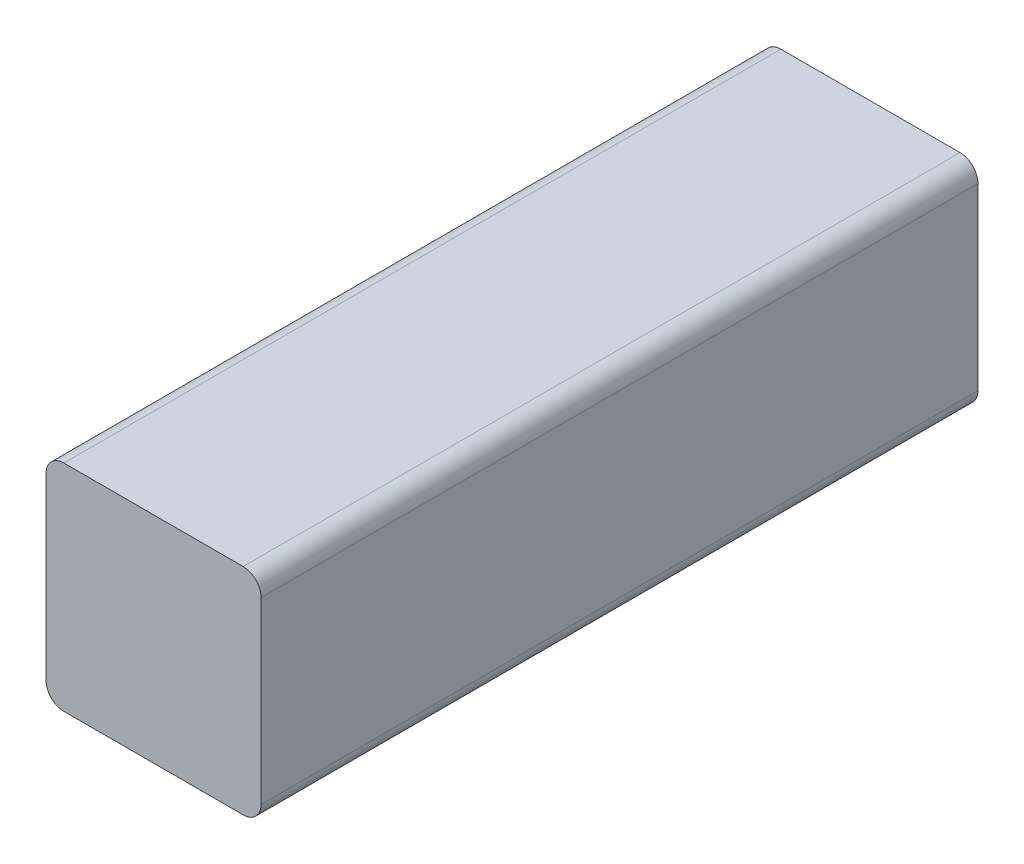
ISO-10303-21;
HEADER;
FILE_DESCRIPTION(('STEP AP214'),'2;1');
FILE_NAME('part.step','',(''),(''),'','','');
FILE_SCHEMA(('AUTOMOTIVE_DESIGN { 1 0 10303 214 1 1 1 1 }'));
ENDSEC;
DATA;
#1=APPLICATION_CONTEXT('core data for automotive mechanical design processes');
#2=APPLICATION_PROTOCOL_DEFINITION('international standard','automotive_design',2000,#1);
#3=PRODUCT_CONTEXT('',#1,'mechanical');
#4=PRODUCT('Part','Part','',(#3));
#5=PRODUCT_RELATED_PRODUCT_CATEGORY('part','',(#4));
#6=PRODUCT_DEFINITION_FORMATION('','',#4);
#7=PRODUCT_DEFINITION_CONTEXT('part definition',#1,'design');
#8=PRODUCT_DEFINITION('design','',#6,#7);
#9=PRODUCT_DEFINITION_SHAPE('','',#8);
#10=(LENGTH_UNIT() NAMED_UNIT(*) SI_UNIT(.MILLI.,.METRE.));
#11=(NAMED_UNIT(*) PLANE_ANGLE_UNIT() SI_UNIT($,.RADIAN.));
#12=(NAMED_UNIT(*) SI_UNIT($,.STERADIAN.) SOLID_ANGLE_UNIT());
#13=UNCERTAINTY_MEASURE_WITH_UNIT(LENGTH_MEASURE(1.E-05),#10,'distance_accuracy_value','');
#14=(GEOMETRIC_REPRESENTATION_CONTEXT(3) GLOBAL_UNCERTAINTY_ASSIGNED_CONTEXT((#13)) GLOBAL_UNIT_ASSIGNED_CONTEXT((#10,
#11,#12)) REPRESENTATION_CONTEXT('',''));
#15=CARTESIAN_POINT('',(0.,0.,0.));
#16=DIRECTION('',(0.,0.,1.));
#17=DIRECTION('',(1.,0.,0.));
#18=AXIS2_PLACEMENT_3D('',#15,#16,#17);
#19=CARTESIAN_POINT('',(-2.5,10.8,-20.));
#20=DIRECTION('',(0.,0.,1.));
#21=DIRECTION('',(1.,0.,0.));
#22=AXIS2_PLACEMENT_3D('',#19,#20,#21);
#23=CYLINDRICAL_SURFACE('',#22,0.5);
#24=CARTESIAN_POINT('',(-2.5,10.8,0.));
#25=DIRECTION('',(0.,0.,1.));
#26=DIRECTION('',(1.,0.,0.));
#27=AXIS2_PLACEMENT_3D('',#24,#25,#26);
#28=CIRCLE('',#27,0.5);
#29=CARTESIAN_POINT('',(-2.5,11.3,0.));
#30=VERTEX_POINT('',#29);
#31=CARTESIAN_POINT('',(-3.,10.8,0.));
#32=VERTEX_POINT('',#31);
#33=EDGE_CURVE('E129',#30,#32,#28,.T.);
#34=ORIENTED_EDGE('',*,*,#33,.F.);
#35=DIRECTION('',(0.,0.,1.));
#36=VECTOR('',#35,1.);
#37=CARTESIAN_POINT('',(-2.5,11.3,-20.));
#38=LINE('',#37,#36);
#39=CARTESIAN_POINT('',(-2.5,11.3,-20.));
#40=VERTEX_POINT('',#39);
#41=EDGE_CURVE('E11',#40,#30,#38,.T.);
#42=ORIENTED_EDGE('',*,*,#41,.F.);
#43=CARTESIAN_POINT('',(-2.5,10.8,-20.));
#44=DIRECTION('',(0.,0.,1.));
#45=DIRECTION('',(1.,0.,0.));
#46=AXIS2_PLACEMENT_3D('',#43,#44,#45);
#47=CIRCLE('',#46,0.5);
#48=CARTESIAN_POINT('',(-3.,10.8,-20.));
#49=VERTEX_POINT('',#48);
#50=EDGE_CURVE('E149',#40,#49,#47,.T.);
#51=ORIENTED_EDGE('',*,*,#50,.T.);
#52=DIRECTION('',(0.,0.,1.));
#53=VECTOR('',#52,1.);
#54=CARTESIAN_POINT('',(-3.,10.8,-20.));
#55=LINE('',#54,#53);
#56=EDGE_CURVE('E35',#49,#32,#55,.T.);
#57=ORIENTED_EDGE('',*,*,#56,.T.);
#58=EDGE_LOOP('',(#34,#42,#51,#57));
#59=FACE_BOUND('',#58,.T.);
#60=ADVANCED_FACE('F32',(#59),#23,.T.);
#61=CARTESIAN_POINT('',(2.5,11.3,-20.));
#62=DIRECTION('',(0.,1.,0.));
#63=DIRECTION('',(0.,0.,1.));
#64=AXIS2_PLACEMENT_3D('',#61,#62,#63);
#65=PLANE('',#64);
#66=DIRECTION('',(-1.,0.,0.));
#67=VECTOR('',#66,1.);
#68=CARTESIAN_POINT('',(2.5,11.3,0.));
#69=LINE('',#68,#67);
#70=CARTESIAN_POINT('',(2.5,11.3,0.));
#71=VERTEX_POINT('',#70);
#72=EDGE_CURVE('E147',#71,#30,#69,.T.);
#73=ORIENTED_EDGE('',*,*,#72,.F.);
#74=DIRECTION('',(0.,0.,1.));
#75=VECTOR('',#74,1.);
#76=CARTESIAN_POINT('',(2.5,11.3,-20.));
#77=LINE('',#76,#75);
#78=CARTESIAN_POINT('',(2.5,11.3,-20.));
#79=VERTEX_POINT('',#78);
#80=EDGE_CURVE('E41',#79,#71,#77,.T.);
#81=ORIENTED_EDGE('',*,*,#80,.F.);
#82=DIRECTION('',(-1.,0.,0.));
#83=VECTOR('',#82,1.);
#84=CARTESIAN_POINT('',(2.5,11.3,-20.));
#85=LINE('',#84,#83);
#86=EDGE_CURVE('E119',#79,#40,#85,.T.);
#87=ORIENTED_EDGE('',*,*,#86,.T.);
#88=ORIENTED_EDGE('',*,*,#41,.T.);
#89=EDGE_LOOP('',(#73,#81,#87,#88));
#90=FACE_BOUND('',#89,.T.);
#91=ADVANCED_FACE('F161',(#90),#65,.T.);
#92=CARTESIAN_POINT('',(2.5,10.8,-20.));
#93=DIRECTION('',(0.,0.,1.));
#94=DIRECTION('',(1.,0.,0.));
#95=AXIS2_PLACEMENT_3D('',#92,#93,#94);
#96=CYLINDRICAL_SURFACE('',#95,0.5);
#97=CARTESIAN_POINT('',(2.5,10.8,0.));
#98=DIRECTION('',(0.,0.,1.));
#99=DIRECTION('',(-1.,0.,0.));
#100=AXIS2_PLACEMENT_3D('',#97,#98,#99);
#101=CIRCLE('',#100,0.5);
#102=CARTESIAN_POINT('',(3.,10.8,0.));
#103=VERTEX_POINT('',#102);
#104=EDGE_CURVE('E106',#103,#71,#101,.T.);
#105=ORIENTED_EDGE('',*,*,#104,.F.);
#106=DIRECTION('',(0.,0.,1.));
#107=VECTOR('',#106,1.);
#108=CARTESIAN_POINT('',(3.,10.8,-20.));
#109=LINE('',#108,#107);
#110=CARTESIAN_POINT('',(3.,10.8,-20.));
#111=VERTEX_POINT('',#110);
#112=EDGE_CURVE('E101',#111,#103,#109,.T.);
#113=ORIENTED_EDGE('',*,*,#112,.F.);
#114=CARTESIAN_POINT('',(2.5,10.8,-20.));
#115=DIRECTION('',(0.,0.,1.));
#116=DIRECTION('',(-1.,0.,0.));
#117=AXIS2_PLACEMENT_3D('',#114,#115,#116);
#118=CIRCLE('',#117,0.5);
#119=EDGE_CURVE('E104',#111,#79,#118,.T.);
#120=ORIENTED_EDGE('',*,*,#119,.T.);
#121=ORIENTED_EDGE('',*,*,#80,.T.);
#122=EDGE_LOOP('',(#105,#113,#120,#121));
#123=FACE_BOUND('',#122,.T.);
#124=ADVANCED_FACE('F103',(#123),#96,.T.);
#125=CARTESIAN_POINT('',(3.,10.8,-20.));
#126=DIRECTION('',(1.,0.,0.));
#127=DIRECTION('',(0.,0.,-1.));
#128=AXIS2_PLACEMENT_3D('',#125,#126,#127);
#129=PLANE('',#128);
#130=DIRECTION('',(0.,1.,0.));
#131=VECTOR('',#130,1.);
#132=CARTESIAN_POINT('',(3.,10.8,0.));
#133=LINE('',#132,#131);
#134=CARTESIAN_POINT('',(3.,5.80000000000001,0.));
#135=VERTEX_POINT('',#134);
#136=EDGE_CURVE('E144',#135,#103,#133,.T.);
#137=ORIENTED_EDGE('',*,*,#136,.F.);
#138=DIRECTION('',(0.,0.,1.));
#139=VECTOR('',#138,1.);
#140=CARTESIAN_POINT('',(3.,5.80000000000001,-20.));
#141=LINE('',#140,#139);
#142=CARTESIAN_POINT('',(3.,5.80000000000001,-20.));
#143=VERTEX_POINT('',#142);
#144=EDGE_CURVE('E111',#143,#135,#141,.T.);
#145=ORIENTED_EDGE('',*,*,#144,.F.);
#146=DIRECTION('',(0.,1.,0.));
#147=VECTOR('',#146,1.);
#148=CARTESIAN_POINT('',(3.,10.8,-20.));
#149=LINE('',#148,#147);
#150=EDGE_CURVE('E117',#143,#111,#149,.T.);
#151=ORIENTED_EDGE('',*,*,#150,.T.);
#152=ORIENTED_EDGE('',*,*,#112,.T.);
#153=EDGE_LOOP('',(#137,#145,#151,#152));
#154=FACE_BOUND('',#153,.T.);
#155=ADVANCED_FACE('F121',(#154),#129,.T.);
#156=CARTESIAN_POINT('',(2.5,5.8,-20.));
#157=DIRECTION('',(0.,0.,1.));
#158=DIRECTION('',(1.,0.,0.));
#159=AXIS2_PLACEMENT_3D('',#156,#157,#158);
#160=CYLINDRICAL_SURFACE('',#159,0.5);
#161=CARTESIAN_POINT('',(2.5,5.8,0.));
#162=DIRECTION('',(0.,0.,1.));
#163=DIRECTION('',(-1.,0.,0.));
#164=AXIS2_PLACEMENT_3D('',#161,#162,#163);
#165=CIRCLE('',#164,0.5);
#166=CARTESIAN_POINT('',(2.5,5.3,0.));
#167=VERTEX_POINT('',#166);
#168=EDGE_CURVE('E141',#167,#135,#165,.T.);
#169=ORIENTED_EDGE('',*,*,#168,.F.);
#170=DIRECTION('',(0.,0.,1.));
#171=VECTOR('',#170,1.);
#172=CARTESIAN_POINT('',(2.5,5.3,-20.));
#173=LINE('',#172,#171);
#174=CARTESIAN_POINT('',(2.5,5.3,-20.));
#175=VERTEX_POINT('',#174);
#176=EDGE_CURVE('E153',#175,#167,#173,.T.);
#177=ORIENTED_EDGE('',*,*,#176,.F.);
#178=CARTESIAN_POINT('',(2.5,5.8,-20.));
#179=DIRECTION('',(0.,0.,1.));
#180=DIRECTION('',(-1.,0.,0.));
#181=AXIS2_PLACEMENT_3D('',#178,#179,#180);
#182=CIRCLE('',#181,0.5);
#183=EDGE_CURVE('E122',#175,#143,#182,.T.);
#184=ORIENTED_EDGE('',*,*,#183,.T.);
#185=ORIENTED_EDGE('',*,*,#144,.T.);
#186=EDGE_LOOP('',(#169,#177,#184,#185));
#187=FACE_BOUND('',#186,.T.);
#188=ADVANCED_FACE('F174',(#187),#160,.T.);
#189=CARTESIAN_POINT('',(2.5,5.3,-20.));
#190=DIRECTION('',(0.,-1.,0.));
#191=DIRECTION('',(0.,0.,-1.));
#192=AXIS2_PLACEMENT_3D('',#189,#190,#191);
#193=PLANE('',#192);
#194=DIRECTION('',(1.,0.,0.));
#195=VECTOR('',#194,1.);
#196=CARTESIAN_POINT('',(2.5,5.3,0.));
#197=LINE('',#196,#195);
#198=CARTESIAN_POINT('',(-2.5,5.3,0.));
#199=VERTEX_POINT('',#198);
#200=EDGE_CURVE('E138',#199,#167,#197,.T.);
#201=ORIENTED_EDGE('',*,*,#200,.F.);
#202=DIRECTION('',(0.,0.,1.));
#203=VECTOR('',#202,1.);
#204=CARTESIAN_POINT('',(-2.5,5.3,-20.));
#205=LINE('',#204,#203);
#206=CARTESIAN_POINT('',(-2.5,5.3,-20.));
#207=VERTEX_POINT('',#206);
#208=EDGE_CURVE('E155',#207,#199,#205,.T.);
#209=ORIENTED_EDGE('',*,*,#208,.F.);
#210=DIRECTION('',(1.,0.,0.));
#211=VECTOR('',#210,1.);
#212=CARTESIAN_POINT('',(2.5,5.3,-20.));
#213=LINE('',#212,#211);
#214=EDGE_CURVE('E124',#207,#175,#213,.T.);
#215=ORIENTED_EDGE('',*,*,#214,.T.);
#216=ORIENTED_EDGE('',*,*,#176,.T.);
#217=EDGE_LOOP('',(#201,#209,#215,#216));
#218=FACE_BOUND('',#217,.T.);
#219=ADVANCED_FACE('F177',(#218),#193,.T.);
#220=CARTESIAN_POINT('',(-2.5,5.8,-20.));
#221=DIRECTION('',(0.,0.,1.));
#222=DIRECTION('',(1.,0.,0.));
#223=AXIS2_PLACEMENT_3D('',#220,#221,#222);
#224=CYLINDRICAL_SURFACE('',#223,0.5);
#225=CARTESIAN_POINT('',(-2.5,5.8,0.));
#226=DIRECTION('',(0.,0.,1.));
#227=DIRECTION('',(-1.,0.,0.));
#228=AXIS2_PLACEMENT_3D('',#225,#226,#227);
#229=CIRCLE('',#228,0.5);
#230=CARTESIAN_POINT('',(-3.,5.8,0.));
#231=VERTEX_POINT('',#230);
#232=EDGE_CURVE('E135',#231,#199,#229,.T.);
#233=ORIENTED_EDGE('',*,*,#232,.F.);
#234=DIRECTION('',(0.,0.,1.));
#235=VECTOR('',#234,1.);
#236=CARTESIAN_POINT('',(-3.,5.8,-20.));
#237=LINE('',#236,#235);
#238=CARTESIAN_POINT('',(-3.,5.8,-20.));
#239=VERTEX_POINT('',#238);
#240=EDGE_CURVE('E156',#239,#231,#237,.T.);
#241=ORIENTED_EDGE('',*,*,#240,.F.);
#242=CARTESIAN_POINT('',(-2.5,5.8,-20.));
#243=DIRECTION('',(0.,0.,1.));
#244=DIRECTION('',(-1.,0.,0.));
#245=AXIS2_PLACEMENT_3D('',#242,#243,#244);
#246=CIRCLE('',#245,0.5);
#247=EDGE_CURVE('E252',#239,#207,#246,.T.);
#248=ORIENTED_EDGE('',*,*,#247,.T.);
#249=ORIENTED_EDGE('',*,*,#208,.T.);
#250=EDGE_LOOP('',(#233,#241,#248,#249));
#251=FACE_BOUND('',#250,.T.);
#252=ADVANCED_FACE('F181',(#251),#224,.T.);
#253=CARTESIAN_POINT('',(-3.,10.8,-20.));
#254=DIRECTION('',(-1.,0.,0.));
#255=DIRECTION('',(0.,0.,1.));
#256=AXIS2_PLACEMENT_3D('',#253,#254,#255);
#257=PLANE('',#256);
#258=DIRECTION('',(0.,-1.,0.));
#259=VECTOR('',#258,1.);
#260=CARTESIAN_POINT('',(-3.,10.8,0.));
#261=LINE('',#260,#259);
#262=EDGE_CURVE('E132',#32,#231,#261,.T.);
#263=ORIENTED_EDGE('',*,*,#262,.F.);
#264=ORIENTED_EDGE('',*,*,#56,.F.);
#265=DIRECTION('',(0.,-1.,0.));
#266=VECTOR('',#265,1.);
#267=CARTESIAN_POINT('',(-3.,10.8,-20.));
#268=LINE('',#267,#266);
#269=EDGE_CURVE('E253',#49,#239,#268,.T.);
#270=ORIENTED_EDGE('',*,*,#269,.T.);
#271=ORIENTED_EDGE('',*,*,#240,.T.);
#272=EDGE_LOOP('',(#263,#264,#270,#271));
#273=FACE_BOUND('',#272,.T.);
#274=ADVANCED_FACE('F158',(#273),#257,.T.);
#275=CARTESIAN_POINT('',(-2.5,10.8,-20.));
#276=DIRECTION('',(0.,0.,1.));
#277=DIRECTION('',(1.,0.,0.));
#278=AXIS2_PLACEMENT_3D('',#275,#276,#277);
#279=PLANE('',#278);
#280=ORIENTED_EDGE('',*,*,#50,.F.);
#281=ORIENTED_EDGE('',*,*,#86,.F.);
#282=ORIENTED_EDGE('',*,*,#119,.F.);
#283=ORIENTED_EDGE('',*,*,#150,.F.);
#284=ORIENTED_EDGE('',*,*,#183,.F.);
#285=ORIENTED_EDGE('',*,*,#214,.F.);
#286=ORIENTED_EDGE('',*,*,#247,.F.);
#287=ORIENTED_EDGE('',*,*,#269,.F.);
#288=EDGE_LOOP('',(#280,#281,#282,#283,#284,#285,#286,#287));
#289=FACE_BOUND('',#288,.T.);
#290=ADVANCED_FACE('F115',(#289),#279,.F.);
#291=CARTESIAN_POINT('',(-2.5,10.8,0.));
#292=DIRECTION('',(0.,0.,1.));
#293=DIRECTION('',(1.,0.,0.));
#294=AXIS2_PLACEMENT_3D('',#291,#292,#293);
#295=PLANE('',#294);
#296=ORIENTED_EDGE('',*,*,#33,.T.);
#297=ORIENTED_EDGE('',*,*,#262,.T.);
#298=ORIENTED_EDGE('',*,*,#232,.T.);
#299=ORIENTED_EDGE('',*,*,#200,.T.);
#300=ORIENTED_EDGE('',*,*,#168,.T.);
#301=ORIENTED_EDGE('',*,*,#136,.T.);
#302=ORIENTED_EDGE('',*,*,#104,.T.);
#303=ORIENTED_EDGE('',*,*,#72,.T.);
#304=EDGE_LOOP('',(#296,#297,#298,#299,#300,#301,#302,#303));
#305=FACE_BOUND('',#304,.T.);
#306=ADVANCED_FACE('F160',(#305),#295,.T.);
#307=CLOSED_SHELL('',(#60,#91,#124,#155,#188,#219,#252,#274,#290,#306));
#308=MANIFOLD_SOLID_BREP('B2',#307);
#309=ADVANCED_BREP_SHAPE_REPRESENTATION('',(#18,#308),#14);
#310=SHAPE_DEFINITION_REPRESENTATION(#9,#309);
ENDSEC;
END-ISO-10303-21;
